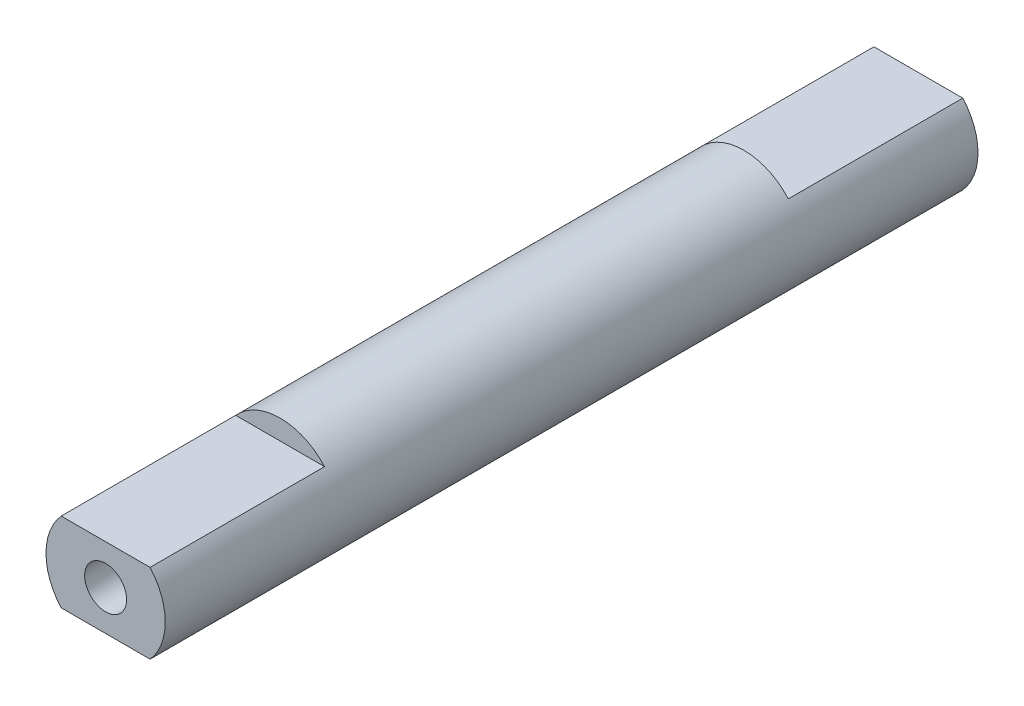
ISO-10303-21;
HEADER;
FILE_DESCRIPTION(('STEP AP214'),'2;1');
FILE_NAME('part.step','',(''),(''),'','','');
FILE_SCHEMA(('AUTOMOTIVE_DESIGN { 1 0 10303 214 1 1 1 1 }'));
ENDSEC;
DATA;
#1=APPLICATION_CONTEXT('core data for automotive mechanical design processes');
#2=APPLICATION_PROTOCOL_DEFINITION('international standard','automotive_design',2000,#1);
#3=PRODUCT_CONTEXT('',#1,'mechanical');
#4=PRODUCT('Part','Part','',(#3));
#5=PRODUCT_RELATED_PRODUCT_CATEGORY('part','',(#4));
#6=PRODUCT_DEFINITION_FORMATION('','',#4);
#7=PRODUCT_DEFINITION_CONTEXT('part definition',#1,'design');
#8=PRODUCT_DEFINITION('design','',#6,#7);
#9=PRODUCT_DEFINITION_SHAPE('','',#8);
#10=(LENGTH_UNIT() NAMED_UNIT(*) SI_UNIT(.MILLI.,.METRE.));
#11=(NAMED_UNIT(*) PLANE_ANGLE_UNIT() SI_UNIT($,.RADIAN.));
#12=(NAMED_UNIT(*) SI_UNIT($,.STERADIAN.) SOLID_ANGLE_UNIT());
#13=UNCERTAINTY_MEASURE_WITH_UNIT(LENGTH_MEASURE(1.E-05),#10,'distance_accuracy_value','');
#14=(GEOMETRIC_REPRESENTATION_CONTEXT(3) GLOBAL_UNCERTAINTY_ASSIGNED_CONTEXT((#13)) GLOBAL_UNIT_ASSIGNED_CONTEXT((#10,
#11,#12)) REPRESENTATION_CONTEXT('',''));
#15=CARTESIAN_POINT('',(0.,0.,0.));
#16=DIRECTION('',(0.,0.,1.));
#17=DIRECTION('',(1.,0.,0.));
#18=AXIS2_PLACEMENT_3D('',#15,#16,#17);
#19=CARTESIAN_POINT('',(0.,-4.725,1.10000000000809));
#20=DIRECTION('',(0.,0.,1.));
#21=DIRECTION('',(1.,0.,0.));
#22=AXIS2_PLACEMENT_3D('',#19,#20,#21);
#23=PLANE('',#22);
#24=CARTESIAN_POINT('',(0.,0.,1.10000000000809));
#25=DIRECTION('',(0.,0.,1.));
#26=DIRECTION('',(1.,0.,0.));
#27=AXIS2_PLACEMENT_3D('',#24,#25,#26);
#28=CIRCLE('',#27,0.95);
#29=CARTESIAN_POINT('',(0.95,0.,1.10000000000809));
#30=VERTEX_POINT('',#29);
#31=EDGE_CURVE('E20',#30,#30,#28,.T.);
#32=ORIENTED_EDGE('',*,*,#31,.T.);
#33=EDGE_LOOP('',(#32));
#34=FACE_BOUND('',#33,.T.);
#35=ADVANCED_FACE('F17',(#34),#23,.T.);
#36=CARTESIAN_POINT('',(0.,-4.725,-19.9000000000081));
#37=DIRECTION('',(0.,0.,-1.));
#38=DIRECTION('',(-1.,0.,0.));
#39=AXIS2_PLACEMENT_3D('',#36,#37,#38);
#40=PLANE('',#39);
#41=CARTESIAN_POINT('',(0.,0.,-19.9000000000081));
#42=DIRECTION('',(0.,0.,-1.));
#43=DIRECTION('',(-1.,0.,0.));
#44=AXIS2_PLACEMENT_3D('',#41,#42,#43);
#45=CIRCLE('',#44,0.95);
#46=CARTESIAN_POINT('',(-0.95,0.,-19.9000000000081));
#47=VERTEX_POINT('',#46);
#48=EDGE_CURVE('E115',#47,#47,#45,.T.);
#49=ORIENTED_EDGE('',*,*,#48,.T.);
#50=EDGE_LOOP('',(#49));
#51=FACE_BOUND('',#50,.T.);
#52=ADVANCED_FACE('F128',(#51),#40,.T.);
#53=CARTESIAN_POINT('',(0.,0.,9.0000000000081));
#54=DIRECTION('',(0.,0.,1.));
#55=DIRECTION('',(1.,0.,0.));
#56=AXIS2_PLACEMENT_3D('',#53,#54,#55);
#57=CYLINDRICAL_SURFACE('',#56,0.95);
#58=ORIENTED_EDGE('',*,*,#31,.F.);
#59=EDGE_LOOP('',(#58));
#60=FACE_BOUND('',#59,.T.);
#61=CARTESIAN_POINT('',(0.,0.,9.0000000000081));
#62=DIRECTION('',(0.,0.,1.));
#63=DIRECTION('',(1.,0.,0.));
#64=AXIS2_PLACEMENT_3D('',#61,#62,#63);
#65=CIRCLE('',#64,0.95);
#66=CARTESIAN_POINT('',(0.95,0.,9.0000000000081));
#67=VERTEX_POINT('',#66);
#68=EDGE_CURVE('E111',#67,#67,#65,.F.);
#69=ORIENTED_EDGE('',*,*,#68,.F.);
#70=EDGE_LOOP('',(#69));
#71=FACE_BOUND('',#70,.T.);
#72=ADVANCED_FACE('F124',(#60,#71),#57,.F.);
#73=CARTESIAN_POINT('',(0.,0.,-27.8000000000081));
#74=DIRECTION('',(0.,0.,-1.));
#75=DIRECTION('',(-1.,0.,0.));
#76=AXIS2_PLACEMENT_3D('',#73,#74,#75);
#77=CYLINDRICAL_SURFACE('',#76,0.95);
#78=ORIENTED_EDGE('',*,*,#48,.F.);
#79=EDGE_LOOP('',(#78));
#80=FACE_BOUND('',#79,.T.);
#81=CARTESIAN_POINT('',(0.,0.,-27.8000000000081));
#82=DIRECTION('',(0.,0.,-1.));
#83=DIRECTION('',(-1.,0.,0.));
#84=AXIS2_PLACEMENT_3D('',#81,#82,#83);
#85=CIRCLE('',#84,0.95);
#86=CARTESIAN_POINT('',(-0.95,0.,-27.8000000000081));
#87=VERTEX_POINT('',#86);
#88=EDGE_CURVE('E107',#87,#87,#85,.F.);
#89=ORIENTED_EDGE('',*,*,#88,.F.);
#90=EDGE_LOOP('',(#89));
#91=FACE_BOUND('',#90,.T.);
#92=ADVANCED_FACE('F127',(#80,#91),#77,.F.);
#93=CARTESIAN_POINT('',(0.,-4.725,1.10000000000809));
#94=DIRECTION('',(0.,0.,1.));
#95=DIRECTION('',(1.,0.,0.));
#96=AXIS2_PLACEMENT_3D('',#93,#94,#95);
#97=PLANE('',#96);
#98=DIRECTION('',(1.,0.,0.));
#99=VECTOR('',#98,1.);
#100=CARTESIAN_POINT('',(0.,1.8,1.10000000000809));
#101=LINE('',#100,#99);
#102=CARTESIAN_POINT('',(-2.01246117974981,1.8,1.10000000000809));
#103=VERTEX_POINT('',#102);
#104=CARTESIAN_POINT('',(2.01246117974981,1.8,1.10000000000809));
#105=VERTEX_POINT('',#104);
#106=EDGE_CURVE('E81',#103,#105,#101,.T.);
#107=ORIENTED_EDGE('',*,*,#106,.T.);
#108=CARTESIAN_POINT('',(0.,0.,1.10000000000809));
#109=DIRECTION('',(0.,0.,1.));
#110=DIRECTION('',(1.,0.,0.));
#111=AXIS2_PLACEMENT_3D('',#108,#109,#110);
#112=CIRCLE('',#111,2.7);
#113=EDGE_CURVE('E79',#103,#105,#112,.F.);
#114=ORIENTED_EDGE('',*,*,#113,.F.);
#115=EDGE_LOOP('',(#107,#114));
#116=FACE_BOUND('',#115,.T.);
#117=ADVANCED_FACE('F83',(#116),#97,.T.);
#118=CARTESIAN_POINT('',(0.,-4.725,1.10000000000809));
#119=DIRECTION('',(0.,0.,1.));
#120=DIRECTION('',(1.,0.,0.));
#121=AXIS2_PLACEMENT_3D('',#118,#119,#120);
#122=PLANE('',#121);
#123=DIRECTION('',(1.,0.,0.));
#124=VECTOR('',#123,1.);
#125=CARTESIAN_POINT('',(0.,-1.8,1.10000000000809));
#126=LINE('',#125,#124);
#127=CARTESIAN_POINT('',(2.01246117974981,-1.8,1.10000000000809));
#128=VERTEX_POINT('',#127);
#129=CARTESIAN_POINT('',(-2.01246117974981,-1.8,1.10000000000809));
#130=VERTEX_POINT('',#129);
#131=EDGE_CURVE('E114',#128,#130,#126,.F.);
#132=ORIENTED_EDGE('',*,*,#131,.T.);
#133=CARTESIAN_POINT('',(0.,0.,1.10000000000809));
#134=DIRECTION('',(0.,0.,1.));
#135=DIRECTION('',(1.,0.,0.));
#136=AXIS2_PLACEMENT_3D('',#133,#134,#135);
#137=CIRCLE('',#136,2.7);
#138=EDGE_CURVE('E190',#128,#130,#137,.F.);
#139=ORIENTED_EDGE('',*,*,#138,.F.);
#140=EDGE_LOOP('',(#132,#139));
#141=FACE_BOUND('',#140,.T.);
#142=ADVANCED_FACE('F144',(#141),#122,.T.);
#143=CARTESIAN_POINT('',(0.,-1.8,9.0000000000081));
#144=DIRECTION('',(0.,1.,0.));
#145=DIRECTION('',(0.,0.,1.));
#146=AXIS2_PLACEMENT_3D('',#143,#144,#145);
#147=PLANE('',#146);
#148=DIRECTION('',(0.,0.,1.));
#149=VECTOR('',#148,1.);
#150=CARTESIAN_POINT('',(2.01246117974981,-1.8,1.10000000000809));
#151=LINE('',#150,#149);
#152=CARTESIAN_POINT('',(2.01246117974981,-1.8,9.0000000000081));
#153=VERTEX_POINT('',#152);
#154=EDGE_CURVE('E192',#153,#128,#151,.F.);
#155=ORIENTED_EDGE('',*,*,#154,.F.);
#156=DIRECTION('',(1.,0.,0.));
#157=VECTOR('',#156,1.);
#158=CARTESIAN_POINT('',(0.,-1.8,9.0000000000081));
#159=LINE('',#158,#157);
#160=CARTESIAN_POINT('',(-2.01246117974981,-1.8,9.0000000000081));
#161=VERTEX_POINT('',#160);
#162=EDGE_CURVE('E113',#161,#153,#159,.T.);
#163=ORIENTED_EDGE('',*,*,#162,.F.);
#164=DIRECTION('',(0.,0.,1.));
#165=VECTOR('',#164,1.);
#166=CARTESIAN_POINT('',(-2.01246117974981,-1.8,1.10000000000809));
#167=LINE('',#166,#165);
#168=EDGE_CURVE('E189',#130,#161,#167,.T.);
#169=ORIENTED_EDGE('',*,*,#168,.F.);
#170=ORIENTED_EDGE('',*,*,#131,.F.);
#171=EDGE_LOOP('',(#155,#163,#169,#170));
#172=FACE_BOUND('',#171,.T.);
#173=ADVANCED_FACE('F134',(#172),#147,.F.);
#174=CARTESIAN_POINT('',(0.,0.,9.0000000000081));
#175=DIRECTION('',(0.,0.,1.));
#176=DIRECTION('',(1.,0.,0.));
#177=AXIS2_PLACEMENT_3D('',#174,#175,#176);
#178=PLANE('',#177);
#179=CARTESIAN_POINT('',(0.,0.,9.0000000000081));
#180=DIRECTION('',(0.,0.,1.));
#181=DIRECTION('',(1.,0.,0.));
#182=AXIS2_PLACEMENT_3D('',#179,#180,#181);
#183=CIRCLE('',#182,2.7);
#184=CARTESIAN_POINT('',(-2.01246117974981,1.8,9.0000000000081));
#185=VERTEX_POINT('',#184);
#186=EDGE_CURVE('E184',#161,#185,#183,.F.);
#187=ORIENTED_EDGE('',*,*,#186,.F.);
#188=ORIENTED_EDGE('',*,*,#162,.T.);
#189=CARTESIAN_POINT('',(0.,0.,9.0000000000081));
#190=DIRECTION('',(0.,0.,1.));
#191=DIRECTION('',(1.,0.,0.));
#192=AXIS2_PLACEMENT_3D('',#189,#190,#191);
#193=CIRCLE('',#192,2.7);
#194=CARTESIAN_POINT('',(2.01246117974981,1.8,9.0000000000081));
#195=VERTEX_POINT('',#194);
#196=EDGE_CURVE('E96',#195,#153,#193,.F.);
#197=ORIENTED_EDGE('',*,*,#196,.F.);
#198=DIRECTION('',(1.,0.,0.));
#199=VECTOR('',#198,1.);
#200=CARTESIAN_POINT('',(0.,1.8,9.0000000000081));
#201=LINE('',#200,#199);
#202=EDGE_CURVE('E88',#195,#185,#201,.F.);
#203=ORIENTED_EDGE('',*,*,#202,.T.);
#204=EDGE_LOOP('',(#187,#188,#197,#203));
#205=FACE_BOUND('',#204,.T.);
#206=ORIENTED_EDGE('',*,*,#68,.T.);
#207=EDGE_LOOP('',(#206));
#208=FACE_BOUND('',#207,.T.);
#209=ADVANCED_FACE('F132',(#205,#208),#178,.T.);
#210=CARTESIAN_POINT('',(0.,1.8,9.0000000000081));
#211=DIRECTION('',(0.,-1.,0.));
#212=DIRECTION('',(0.,0.,-1.));
#213=AXIS2_PLACEMENT_3D('',#210,#211,#212);
#214=PLANE('',#213);
#215=DIRECTION('',(0.,0.,1.));
#216=VECTOR('',#215,1.);
#217=CARTESIAN_POINT('',(-2.01246117974981,1.8,1.10000000000809));
#218=LINE('',#217,#216);
#219=EDGE_CURVE('E100',#185,#103,#218,.F.);
#220=ORIENTED_EDGE('',*,*,#219,.F.);
#221=ORIENTED_EDGE('',*,*,#202,.F.);
#222=DIRECTION('',(0.,0.,1.));
#223=VECTOR('',#222,1.);
#224=CARTESIAN_POINT('',(2.01246117974981,1.8,1.10000000000809));
#225=LINE('',#224,#223);
#226=EDGE_CURVE('E91',#105,#195,#225,.T.);
#227=ORIENTED_EDGE('',*,*,#226,.F.);
#228=ORIENTED_EDGE('',*,*,#106,.F.);
#229=EDGE_LOOP('',(#220,#221,#227,#228));
#230=FACE_BOUND('',#229,.T.);
#231=ADVANCED_FACE('F92',(#230),#214,.F.);
#232=CARTESIAN_POINT('',(0.,-4.725,-19.9000000000081));
#233=DIRECTION('',(0.,0.,-1.));
#234=DIRECTION('',(-1.,0.,0.));
#235=AXIS2_PLACEMENT_3D('',#232,#233,#234);
#236=PLANE('',#235);
#237=DIRECTION('',(1.,0.,0.));
#238=VECTOR('',#237,1.);
#239=CARTESIAN_POINT('',(0.,1.8,-19.9000000000081));
#240=LINE('',#239,#238);
#241=CARTESIAN_POINT('',(2.01246117974981,1.8,-19.9000000000081));
#242=VERTEX_POINT('',#241);
#243=CARTESIAN_POINT('',(-2.01246117974981,1.8,-19.9000000000081));
#244=VERTEX_POINT('',#243);
#245=EDGE_CURVE('E101',#242,#244,#240,.F.);
#246=ORIENTED_EDGE('',*,*,#245,.T.);
#247=CARTESIAN_POINT('',(0.,0.,-19.9000000000081));
#248=DIRECTION('',(0.,0.,1.));
#249=DIRECTION('',(1.,0.,0.));
#250=AXIS2_PLACEMENT_3D('',#247,#248,#249);
#251=CIRCLE('',#250,2.7);
#252=EDGE_CURVE('E177',#242,#244,#251,.T.);
#253=ORIENTED_EDGE('',*,*,#252,.F.);
#254=EDGE_LOOP('',(#246,#253));
#255=FACE_BOUND('',#254,.T.);
#256=ADVANCED_FACE('F142',(#255),#236,.T.);
#257=CARTESIAN_POINT('',(0.,-4.725,-19.9000000000081));
#258=DIRECTION('',(0.,0.,-1.));
#259=DIRECTION('',(-1.,0.,0.));
#260=AXIS2_PLACEMENT_3D('',#257,#258,#259);
#261=PLANE('',#260);
#262=DIRECTION('',(1.,0.,0.));
#263=VECTOR('',#262,1.);
#264=CARTESIAN_POINT('',(0.,-1.8,-19.9000000000081));
#265=LINE('',#264,#263);
#266=CARTESIAN_POINT('',(-2.01246117974981,-1.8,-19.9000000000081));
#267=VERTEX_POINT('',#266);
#268=CARTESIAN_POINT('',(2.01246117974981,-1.8,-19.9000000000081));
#269=VERTEX_POINT('',#268);
#270=EDGE_CURVE('E87',#267,#269,#265,.T.);
#271=ORIENTED_EDGE('',*,*,#270,.T.);
#272=CARTESIAN_POINT('',(0.,0.,-19.9000000000081));
#273=DIRECTION('',(0.,0.,1.));
#274=DIRECTION('',(1.,0.,0.));
#275=AXIS2_PLACEMENT_3D('',#272,#273,#274);
#276=CIRCLE('',#275,2.7);
#277=EDGE_CURVE('E202',#267,#269,#276,.T.);
#278=ORIENTED_EDGE('',*,*,#277,.F.);
#279=EDGE_LOOP('',(#271,#278));
#280=FACE_BOUND('',#279,.T.);
#281=ADVANCED_FACE('F165',(#280),#261,.T.);
#282=CARTESIAN_POINT('',(0.,-1.8,-27.8000000000081));
#283=DIRECTION('',(0.,1.,0.));
#284=DIRECTION('',(0.,0.,1.));
#285=AXIS2_PLACEMENT_3D('',#282,#283,#284);
#286=PLANE('',#285);
#287=DIRECTION('',(0.,0.,1.));
#288=VECTOR('',#287,1.);
#289=CARTESIAN_POINT('',(-2.01246117974981,-1.8,1.10000000000809));
#290=LINE('',#289,#288);
#291=CARTESIAN_POINT('',(-2.01246117974981,-1.8,-27.8000000000081));
#292=VERTEX_POINT('',#291);
#293=EDGE_CURVE('E204',#292,#267,#290,.T.);
#294=ORIENTED_EDGE('',*,*,#293,.F.);
#295=DIRECTION('',(-1.,0.,0.));
#296=VECTOR('',#295,1.);
#297=CARTESIAN_POINT('',(0.,-1.8,-27.8000000000081));
#298=LINE('',#297,#296);
#299=CARTESIAN_POINT('',(2.01246117974981,-1.8,-27.8000000000081));
#300=VERTEX_POINT('',#299);
#301=EDGE_CURVE('E110',#300,#292,#298,.T.);
#302=ORIENTED_EDGE('',*,*,#301,.F.);
#303=DIRECTION('',(0.,0.,1.));
#304=VECTOR('',#303,1.);
#305=CARTESIAN_POINT('',(2.01246117974981,-1.8,1.10000000000809));
#306=LINE('',#305,#304);
#307=EDGE_CURVE('E201',#269,#300,#306,.F.);
#308=ORIENTED_EDGE('',*,*,#307,.F.);
#309=ORIENTED_EDGE('',*,*,#270,.F.);
#310=EDGE_LOOP('',(#294,#302,#308,#309));
#311=FACE_BOUND('',#310,.T.);
#312=ADVANCED_FACE('F162',(#311),#286,.F.);
#313=CARTESIAN_POINT('',(0.,0.,-27.8000000000081));
#314=DIRECTION('',(0.,0.,-1.));
#315=DIRECTION('',(-1.,0.,0.));
#316=AXIS2_PLACEMENT_3D('',#313,#314,#315);
#317=PLANE('',#316);
#318=CARTESIAN_POINT('',(0.,0.,-27.8000000000081));
#319=DIRECTION('',(0.,0.,1.));
#320=DIRECTION('',(1.,0.,0.));
#321=AXIS2_PLACEMENT_3D('',#318,#319,#320);
#322=CIRCLE('',#321,2.7);
#323=CARTESIAN_POINT('',(-2.01246117974981,1.8,-27.8000000000081));
#324=VERTEX_POINT('',#323);
#325=EDGE_CURVE('E181',#324,#292,#322,.T.);
#326=ORIENTED_EDGE('',*,*,#325,.F.);
#327=DIRECTION('',(1.,0.,0.));
#328=VECTOR('',#327,1.);
#329=CARTESIAN_POINT('',(0.,1.8,-27.8000000000081));
#330=LINE('',#329,#328);
#331=CARTESIAN_POINT('',(2.01246117974981,1.8,-27.8000000000081));
#332=VERTEX_POINT('',#331);
#333=EDGE_CURVE('E35',#324,#332,#330,.T.);
#334=ORIENTED_EDGE('',*,*,#333,.T.);
#335=CARTESIAN_POINT('',(0.,0.,-27.8000000000081));
#336=DIRECTION('',(0.,0.,1.));
#337=DIRECTION('',(1.,0.,0.));
#338=AXIS2_PLACEMENT_3D('',#335,#336,#337);
#339=CIRCLE('',#338,2.7);
#340=EDGE_CURVE('E26',#300,#332,#339,.T.);
#341=ORIENTED_EDGE('',*,*,#340,.F.);
#342=ORIENTED_EDGE('',*,*,#301,.T.);
#343=EDGE_LOOP('',(#326,#334,#341,#342));
#344=FACE_BOUND('',#343,.T.);
#345=ORIENTED_EDGE('',*,*,#88,.T.);
#346=EDGE_LOOP('',(#345));
#347=FACE_BOUND('',#346,.T.);
#348=ADVANCED_FACE('F155',(#344,#347),#317,.T.);
#349=CARTESIAN_POINT('',(0.,1.8,-27.8000000000081));
#350=DIRECTION('',(0.,-1.,0.));
#351=DIRECTION('',(0.,0.,-1.));
#352=AXIS2_PLACEMENT_3D('',#349,#350,#351);
#353=PLANE('',#352);
#354=DIRECTION('',(0.,0.,1.));
#355=VECTOR('',#354,1.);
#356=CARTESIAN_POINT('',(2.01246117974981,1.8,1.10000000000809));
#357=LINE('',#356,#355);
#358=EDGE_CURVE('E11',#332,#242,#357,.T.);
#359=ORIENTED_EDGE('',*,*,#358,.F.);
#360=ORIENTED_EDGE('',*,*,#333,.F.);
#361=DIRECTION('',(0.,0.,1.));
#362=VECTOR('',#361,1.);
#363=CARTESIAN_POINT('',(-2.01246117974981,1.8,1.10000000000809));
#364=LINE('',#363,#362);
#365=EDGE_CURVE('E179',#244,#324,#364,.F.);
#366=ORIENTED_EDGE('',*,*,#365,.F.);
#367=ORIENTED_EDGE('',*,*,#245,.F.);
#368=EDGE_LOOP('',(#359,#360,#366,#367));
#369=FACE_BOUND('',#368,.T.);
#370=ADVANCED_FACE('F149',(#369),#353,.F.);
#371=CARTESIAN_POINT('',(0.,0.,1.10000000000809));
#372=DIRECTION('',(0.,0.,1.));
#373=DIRECTION('',(1.,0.,0.));
#374=AXIS2_PLACEMENT_3D('',#371,#372,#373);
#375=CYLINDRICAL_SURFACE('',#374,2.7);
#376=ORIENTED_EDGE('',*,*,#340,.T.);
#377=ORIENTED_EDGE('',*,*,#358,.T.);
#378=ORIENTED_EDGE('',*,*,#252,.T.);
#379=ORIENTED_EDGE('',*,*,#365,.T.);
#380=ORIENTED_EDGE('',*,*,#325,.T.);
#381=ORIENTED_EDGE('',*,*,#293,.T.);
#382=ORIENTED_EDGE('',*,*,#277,.T.);
#383=ORIENTED_EDGE('',*,*,#307,.T.);
#384=EDGE_LOOP('',(#376,#377,#378,#379,#380,#381,#382,#383));
#385=FACE_BOUND('',#384,.T.);
#386=ORIENTED_EDGE('',*,*,#186,.T.);
#387=ORIENTED_EDGE('',*,*,#219,.T.);
#388=ORIENTED_EDGE('',*,*,#113,.T.);
#389=ORIENTED_EDGE('',*,*,#226,.T.);
#390=ORIENTED_EDGE('',*,*,#196,.T.);
#391=ORIENTED_EDGE('',*,*,#154,.T.);
#392=ORIENTED_EDGE('',*,*,#138,.T.);
#393=ORIENTED_EDGE('',*,*,#168,.T.);
#394=EDGE_LOOP('',(#386,#387,#388,#389,#390,#391,#392,#393));
#395=FACE_BOUND('',#394,.T.);
#396=ADVANCED_FACE('F99',(#385,#395),#375,.T.);
#397=CLOSED_SHELL('',(#35,#52,#72,#92,#117,#142,#173,#209,#231,#256,#281,#312,#348,#370,#396));
#398=MANIFOLD_SOLID_BREP('B1',#397);
#399=ADVANCED_BREP_SHAPE_REPRESENTATION('',(#18,#398),#14);
#400=SHAPE_DEFINITION_REPRESENTATION(#9,#399);
ENDSEC;
END-ISO-10303-21;
